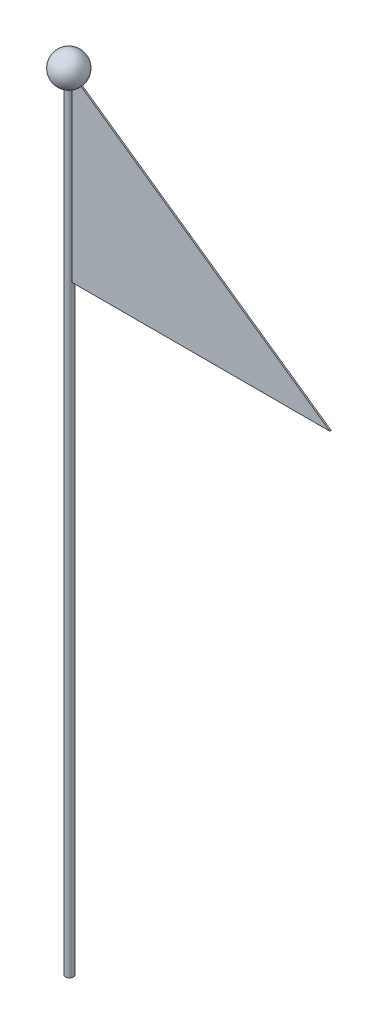
ISO-10303-21;
HEADER;
FILE_DESCRIPTION(('STEP AP214'),'2;1');
FILE_NAME('part.step','',(''),(''),'','','');
FILE_SCHEMA(('AUTOMOTIVE_DESIGN { 1 0 10303 214 1 1 1 1 }'));
ENDSEC;
DATA;
#1=APPLICATION_CONTEXT('core data for automotive mechanical design processes');
#2=APPLICATION_PROTOCOL_DEFINITION('international standard','automotive_design',2000,#1);
#3=PRODUCT_CONTEXT('',#1,'mechanical');
#4=PRODUCT('Part','Part','',(#3));
#5=PRODUCT_RELATED_PRODUCT_CATEGORY('part','',(#4));
#6=PRODUCT_DEFINITION_FORMATION('','',#4);
#7=PRODUCT_DEFINITION_CONTEXT('part definition',#1,'design');
#8=PRODUCT_DEFINITION('design','',#6,#7);
#9=PRODUCT_DEFINITION_SHAPE('','',#8);
#10=(LENGTH_UNIT() NAMED_UNIT(*) SI_UNIT(.MILLI.,.METRE.));
#11=(NAMED_UNIT(*) PLANE_ANGLE_UNIT() SI_UNIT($,.RADIAN.));
#12=(NAMED_UNIT(*) SI_UNIT($,.STERADIAN.) SOLID_ANGLE_UNIT());
#13=UNCERTAINTY_MEASURE_WITH_UNIT(LENGTH_MEASURE(1.E-05),#10,'distance_accuracy_value','');
#14=(GEOMETRIC_REPRESENTATION_CONTEXT(3) GLOBAL_UNCERTAINTY_ASSIGNED_CONTEXT((#13)) GLOBAL_UNIT_ASSIGNED_CONTEXT((#10,
#11,#12)) REPRESENTATION_CONTEXT('',''));
#15=CARTESIAN_POINT('',(0.,0.,0.));
#16=DIRECTION('',(0.,0.,1.));
#17=DIRECTION('',(1.,0.,0.));
#18=AXIS2_PLACEMENT_3D('',#15,#16,#17);
#19=CARTESIAN_POINT('',(0.,-600.,-0.5));
#20=DIRECTION('',(0.,1.,0.));
#21=DIRECTION('',(0.,0.,1.));
#22=AXIS2_PLACEMENT_3D('',#19,#20,#21);
#23=CYLINDRICAL_SURFACE('',#22,3.);
#24=CARTESIAN_POINT('',(-2.09833722086857,-11.5154653786171,-2.64405711386764));
#25=CARTESIAN_POINT('',(-2.21884287735009,-11.5205865961818,-2.52611061655906));
#26=CARTESIAN_POINT('',(-2.32946029768462,-11.526149897107,-2.39790363809497));
#27=CARTESIAN_POINT('',(-2.52766501390432,-11.5379977568933,-2.12464285912076));
#28=CARTESIAN_POINT('',(-2.61522414844018,-11.5442831843699,-1.97956876730836));
#29=CARTESIAN_POINT('',(-2.76468431184615,-11.5573867404033,-1.67685457614372));
#30=CARTESIAN_POINT('',(-2.8265984347987,-11.5642045949895,-1.51922093871473));
#31=CARTESIAN_POINT('',(-2.9230557335242,-11.5781775879587,-1.19585251278525));
#32=CARTESIAN_POINT('',(-2.95760572190757,-11.5853326419219,-1.03011975156893));
#33=CARTESIAN_POINT('',(-2.99840361454821,-11.5997821505947,-0.695106277350074));
#34=CARTESIAN_POINT('',(-3.00463386744059,-11.6070766894003,-0.525823417620668));
#35=CARTESIAN_POINT('',(-2.98856645063279,-11.6215939374037,-0.18860706800513));
#36=CARTESIAN_POINT('',(-2.96626759200543,-11.6288166435952,-0.0206736346487243));
#37=CARTESIAN_POINT('',(-2.89376190141411,-11.6429873672447,0.309104594114983));
#38=CARTESIAN_POINT('',(-2.84354944114666,-11.6499353290025,0.470948154573937));
#39=CARTESIAN_POINT('',(-2.71663113556377,-11.6633595753419,0.783911476173151));
#40=CARTESIAN_POINT('',(-2.63992537524604,-11.6698358614368,0.935031271716288));
#41=CARTESIAN_POINT('',(-2.46222387024155,-11.6821330292276,1.22219426358163));
#42=CARTESIAN_POINT('',(-2.36123718299766,-11.6879541541305,1.35824305421858));
#43=CARTESIAN_POINT('',(-2.13781899465343,-11.6987812711163,1.61145384987166));
#44=CARTESIAN_POINT('',(-2.0153876169152,-11.703787267888,1.72861596352728));
#45=CARTESIAN_POINT('',(-1.75265875906397,-11.7128411233779,1.94062664383531));
#46=CARTESIAN_POINT('',(-1.61237560116498,-11.7168897428239,2.03549292628482));
#47=CARTESIAN_POINT('',(-1.31784799441581,-11.7239215903017,2.20032503081649));
#48=CARTESIAN_POINT('',(-1.16360359948885,-11.7269048224483,2.27029094906749));
#49=CARTESIAN_POINT('',(-0.845676816640813,-11.7317210776196,2.38327361063245));
#50=CARTESIAN_POINT('',(-0.682002776610422,-11.7335551014381,2.42631380229375));
#51=CARTESIAN_POINT('',(-0.349744050129343,-11.7360263143853,2.48431209396417));
#52=CARTESIAN_POINT('',(-0.181159384385559,-11.73666350856,2.49927031237068));
#53=CARTESIAN_POINT('',(0.156032304885742,-11.7367234386341,2.50067707397895));
#54=CARTESIAN_POINT('',(0.324639260591168,-11.7361468682911,2.48714190329571));
#55=CARTESIAN_POINT('',(0.65718501750307,-11.7337966066423,2.43198143440767));
#56=CARTESIAN_POINT('',(0.821123823112077,-11.7320229164655,2.39035616269554));
#57=CARTESIAN_POINT('',(1.13967683886114,-11.7273274959477,2.28020472349768));
#58=CARTESIAN_POINT('',(1.29429132018055,-11.7244057990128,2.21167933878371));
#59=CARTESIAN_POINT('',(1.58981914433573,-11.7174951396611,2.04968045013669));
#60=CARTESIAN_POINT('',(1.73073245897503,-11.7135061750479,1.95620689486274));
#61=CARTESIAN_POINT('',(1.99493978652167,-11.7045690250923,1.746916144877));
#62=CARTESIAN_POINT('',(2.11822450553634,-11.6996203369941,1.63108723935805));
#63=CARTESIAN_POINT('',(2.34360075563056,-11.6889024001229,1.38041065280345));
#64=CARTESIAN_POINT('',(2.44569219259298,-11.6831331477061,1.24556288731151));
#65=CARTESIAN_POINT('',(2.62587747326923,-11.6709292915723,0.960553321580823));
#66=CARTESIAN_POINT('',(2.70395067531341,-11.6644941218662,0.810378495784326));
#67=CARTESIAN_POINT('',(2.83377744813021,-11.6511423368069,0.499073220711405));
#68=CARTESIAN_POINT('',(2.88553089528514,-11.6442257191927,0.337942719982778));
#69=CARTESIAN_POINT('',(2.96129046646025,-11.6300992155395,0.00915786377289607));
#70=CARTESIAN_POINT('',(2.9852737390918,-11.6228890930251,-0.158501747269686));
#71=CARTESIAN_POINT('',(3.00473964422691,-11.6083844071586,-0.495464052593353));
#72=CARTESIAN_POINT('',(3.00022217478962,-11.6010898435046,-0.664766752749241));
#73=CARTESIAN_POINT('',(2.96280599290766,-11.5866201474837,-1.00028593417167));
#74=CARTESIAN_POINT('',(2.9298950786367,-11.5794450678153,-1.16650105720499));
#75=CARTESIAN_POINT('',(2.83660509741384,-11.5654225662293,-1.49105006406071));
#76=CARTESIAN_POINT('',(2.77622605737745,-11.5585751439905,-1.64938395560561));
#77=CARTESIAN_POINT('',(2.62971826772468,-11.5454058918125,-1.95364619301627));
#78=CARTESIAN_POINT('',(2.54359361693635,-11.5390839784142,-2.09957650884622));
#79=CARTESIAN_POINT('',(2.34802806285612,-11.5271474549699,-2.3749072429916));
#80=CARTESIAN_POINT('',(2.23858719026123,-11.5215328439925,-2.50430768306911));
#81=CARTESIAN_POINT('',(1.99957430575861,-11.5111780187829,-2.7428074727851));
#82=CARTESIAN_POINT('',(1.87001622192704,-11.5064372045103,-2.8519207541678));
#83=CARTESIAN_POINT('',(1.59438855943176,-11.4979638925616,-3.04684434643672));
#84=CARTESIAN_POINT('',(1.44831902981453,-11.4942313918904,-3.13265472654057));
#85=CARTESIAN_POINT('',(1.14395616062785,-11.4878873177269,-3.27845508194393));
#86=CARTESIAN_POINT('',(0.985673925026176,-11.4852747398312,-3.33846819367078));
#87=CARTESIAN_POINT('',(0.661272863941099,-11.4812427255452,-3.43106959322617));
#88=CARTESIAN_POINT('',(0.495154383213852,-11.4798232367166,-3.46365908637257));
#89=CARTESIAN_POINT('',(0.159940793209374,-11.4782197849481,-3.50047122131539));
#90=CARTESIAN_POINT('',(-0.00915168953449652,-11.4780347817778,-3.50471774611004));
#91=CARTESIAN_POINT('',(-0.345694970286541,-11.4789032634719,-3.48478004981468));
#92=CARTESIAN_POINT('',(-0.513145352874546,-11.4799570539726,-3.46058881253398));
#93=CARTESIAN_POINT('',(-0.841630082695032,-11.4832723453062,-3.38445896550704));
#94=CARTESIAN_POINT('',(-1.0026627980562,-11.4855341512317,-3.33251334620052));
#95=CARTESIAN_POINT('',(-1.31357245619867,-11.4911978074179,-3.20238090405853));
#96=CARTESIAN_POINT('',(-1.46346258602474,-11.4945982829639,-3.12422572382849));
#97=CARTESIAN_POINT('',(-1.69431466894698,-11.5009579603361,-2.97797191905887));
#98=CARTESIAN_POINT('',(-1.77998880653241,-11.5036016621179,-2.91715679913551));
#99=CARTESIAN_POINT('',(-1.94449793063287,-11.5092616147411,-2.78690512059727));
#100=CARTESIAN_POINT('',(-2.0233329177356,-11.5122778655505,-2.71746856272325));
#101=CARTESIAN_POINT('',(-2.09833722086857,-11.5154653786171,-2.64405711386764));
#102=B_SPLINE_CURVE_WITH_KNOTS('',3,(#24,#25,#26,#27,#28,#29,#30,#31,#32,#33,#34,#35,#36,#37,
#38,#39,#40,#41,#42,#43,#44,#45,#46,#47,#48,#49,#50,#51,#52,#53,#54,#55,#56,#57,#58,#59,#60,#61,
#62,#63,#64,#65,#66,#67,#68,#69,#70,#71,#72,#73,#74,#75,#76,#77,#78,#79,#80,#81,#82,#83,#84,#85,
#86,#87,#88,#89,#90,#91,#92,#93,#94,#95,#96,#97,#98,#99,#100,#101),.UNSPECIFIED.,.T.,.F.,(4,2,2,
2,2,2,2,2,2,2,2,2,2,2,2,2,2,2,2,2,2,2,2,2,2,2,2,2,2,2,2,2,2,2,2,2,2,2,4),(0.,0.505712124684648,
1.01203904669454,1.51810712368354,2.02404916966916,2.53030652030145,3.03658496947845,
3.54296553814819,4.04934448222652,4.555534825516,5.06172225700528,5.56750611247222,
6.07328801450711,6.57862883950979,7.08396753392243,7.58901746768815,8.09406692512574,
8.59910168711768,9.10413748842977,9.60943857338958,10.1147419022906,10.6204782918496,
11.1262170567118,11.6323716863867,12.1385281264658,12.6449021911092,13.151275759567,
13.6575687537543,14.1638610813846,14.6698044296341,15.1757462750414,15.6812334120754,
16.1866983308709,16.6917372694591,17.1969008378725,17.7021920491722,18.2068754092992,
18.5216373040089,18.8363991716702),.UNSPECIFIED.);
#103=CARTESIAN_POINT('',(3.,-11.6081867662439,-0.5));
#104=VERTEX_POINT('',#103);
#105=CARTESIAN_POINT('',(2.82842712474619,-11.651180197731,0.5));
#106=VERTEX_POINT('',#105);
#107=EDGE_CURVE('E70',#104,#106,#102,.T.);
#108=ORIENTED_EDGE('',*,*,#107,.F.);
#109=DIRECTION('',(0.,1.,0.));
#110=VECTOR('',#109,1.);
#111=CARTESIAN_POINT('',(3.,-600.,-0.5));
#112=LINE('',#111,#110);
#113=CARTESIAN_POINT('',(3.,-140.,-0.5));
#114=VERTEX_POINT('',#113);
#115=EDGE_CURVE('E98',#114,#104,#112,.T.);
#116=ORIENTED_EDGE('',*,*,#115,.F.);
#117=CARTESIAN_POINT('',(0.,-140.,-0.5));
#118=DIRECTION('',(0.,-1.,0.));
#119=DIRECTION('',(0.,0.,-1.));
#120=AXIS2_PLACEMENT_3D('',#117,#118,#119);
#121=CIRCLE('',#120,3.);
#122=CARTESIAN_POINT('',(2.82842712474619,-140.,0.5));
#123=VERTEX_POINT('',#122);
#124=EDGE_CURVE('E131',#114,#123,#121,.T.);
#125=ORIENTED_EDGE('',*,*,#124,.T.);
#126=DIRECTION('',(0.,1.,0.));
#127=VECTOR('',#126,1.);
#128=CARTESIAN_POINT('',(2.82842712474619,-600.,0.5));
#129=LINE('',#128,#127);
#130=EDGE_CURVE('E55',#123,#106,#129,.T.);
#131=ORIENTED_EDGE('',*,*,#130,.T.);
#132=EDGE_LOOP('',(#108,#116,#125,#131));
#133=FACE_BOUND('',#132,.T.);
#134=CARTESIAN_POINT('',(0.,-600.,-0.5));
#135=DIRECTION('',(0.,1.,0.));
#136=DIRECTION('',(0.,0.,1.));
#137=AXIS2_PLACEMENT_3D('',#134,#135,#136);
#138=CIRCLE('',#137,3.);
#139=CARTESIAN_POINT('',(0.,-600.,2.5));
#140=VERTEX_POINT('',#139);
#141=EDGE_CURVE('E107',#140,#140,#138,.T.);
#142=ORIENTED_EDGE('',*,*,#141,.T.);
#143=EDGE_LOOP('',(#142));
#144=FACE_BOUND('',#143,.T.);
#145=ADVANCED_FACE('F47',(#133,#144),#23,.T.);
#146=CARTESIAN_POINT('',(0.,-600.,-0.5));
#147=DIRECTION('',(0.,1.,0.));
#148=DIRECTION('',(0.,0.,1.));
#149=AXIS2_PLACEMENT_3D('',#146,#147,#148);
#150=PLANE('',#149);
#151=ORIENTED_EDGE('',*,*,#141,.F.);
#152=EDGE_LOOP('',(#151));
#153=FACE_BOUND('',#152,.T.);
#154=ADVANCED_FACE('F120',(#153),#150,.F.);
#155=CARTESIAN_POINT('',(200.,-140.,-0.5));
#156=DIRECTION('',(0.573462344363328,0.819231920519041,0.));
#157=DIRECTION('',(-0.81923192051904,0.573462344363328,0.));
#158=AXIS2_PLACEMENT_3D('',#155,#156,#157);
#159=PLANE('',#158);
#160=CARTESIAN_POINT('',(0.,0.,0.));
#161=DIRECTION('',(0.573462344363328,0.819231920519041,0.));
#162=DIRECTION('',(-0.81923192051904,0.573462344363328,0.));
#163=AXIS2_PLACEMENT_3D('',#160,#161,#162);
#164=CIRCLE('',#163,12.);
#165=CARTESIAN_POINT('',(9.82224567332308,-6.87557197132617,0.5));
#166=VERTEX_POINT('',#165);
#167=CARTESIAN_POINT('',(9.82224567332308,-6.87557197132617,-0.5));
#168=VERTEX_POINT('',#167);
#169=EDGE_CURVE('E101',#166,#168,#164,.T.);
#170=ORIENTED_EDGE('',*,*,#169,.F.);
#171=DIRECTION('',(-0.819231920519041,0.573462344363328,0.));
#172=VECTOR('',#171,1.);
#173=CARTESIAN_POINT('',(200.,-140.,0.5));
#174=LINE('',#173,#172);
#175=CARTESIAN_POINT('',(200.,-140.,0.5));
#176=VERTEX_POINT('',#175);
#177=EDGE_CURVE('E90',#176,#166,#174,.T.);
#178=ORIENTED_EDGE('',*,*,#177,.F.);
#179=DIRECTION('',(0.,0.,1.));
#180=VECTOR('',#179,1.);
#181=CARTESIAN_POINT('',(200.,-140.,-0.5));
#182=LINE('',#181,#180);
#183=CARTESIAN_POINT('',(200.,-140.,-0.5));
#184=VERTEX_POINT('',#183);
#185=EDGE_CURVE('E140',#184,#176,#182,.T.);
#186=ORIENTED_EDGE('',*,*,#185,.F.);
#187=DIRECTION('',(-0.819231920519041,0.573462344363328,0.));
#188=VECTOR('',#187,1.);
#189=CARTESIAN_POINT('',(200.,-140.,-0.5));
#190=LINE('',#189,#188);
#191=EDGE_CURVE('E102',#184,#168,#190,.T.);
#192=ORIENTED_EDGE('',*,*,#191,.T.);
#193=EDGE_LOOP('',(#170,#178,#186,#192));
#194=FACE_BOUND('',#193,.T.);
#195=ADVANCED_FACE('F49',(#194),#159,.T.);
#196=CARTESIAN_POINT('',(0.,-140.,-0.5));
#197=DIRECTION('',(0.,-1.,0.));
#198=DIRECTION('',(0.,0.,-1.));
#199=AXIS2_PLACEMENT_3D('',#196,#197,#198);
#200=PLANE('',#199);
#201=ORIENTED_EDGE('',*,*,#124,.F.);
#202=DIRECTION('',(1.,0.,0.));
#203=VECTOR('',#202,1.);
#204=CARTESIAN_POINT('',(0.,-140.,-0.5));
#205=LINE('',#204,#203);
#206=EDGE_CURVE('E138',#114,#184,#205,.T.);
#207=ORIENTED_EDGE('',*,*,#206,.T.);
#208=ORIENTED_EDGE('',*,*,#185,.T.);
#209=DIRECTION('',(1.,0.,0.));
#210=VECTOR('',#209,1.);
#211=CARTESIAN_POINT('',(0.,-140.,0.5));
#212=LINE('',#211,#210);
#213=EDGE_CURVE('E94',#123,#176,#212,.T.);
#214=ORIENTED_EDGE('',*,*,#213,.F.);
#215=EDGE_LOOP('',(#201,#207,#208,#214));
#216=FACE_BOUND('',#215,.T.);
#217=ADVANCED_FACE('F127',(#216),#200,.T.);
#218=CARTESIAN_POINT('',(0.,0.,-0.5));
#219=DIRECTION('',(0.,0.,1.));
#220=DIRECTION('',(1.,0.,0.));
#221=AXIS2_PLACEMENT_3D('',#218,#219,#220);
#222=PLANE('',#221);
#223=ORIENTED_EDGE('',*,*,#115,.T.);
#224=CARTESIAN_POINT('',(0.,0.,-0.5));
#225=DIRECTION('',(0.,0.,1.));
#226=DIRECTION('',(1.,0.,0.));
#227=AXIS2_PLACEMENT_3D('',#224,#225,#226);
#228=CIRCLE('',#227,11.9895788082818);
#229=EDGE_CURVE('E62',#104,#168,#228,.T.);
#230=ORIENTED_EDGE('',*,*,#229,.T.);
#231=ORIENTED_EDGE('',*,*,#191,.F.);
#232=ORIENTED_EDGE('',*,*,#206,.F.);
#233=EDGE_LOOP('',(#223,#230,#231,#232));
#234=FACE_BOUND('',#233,.T.);
#235=ADVANCED_FACE('F143',(#234),#222,.F.);
#236=CARTESIAN_POINT('',(0.,0.,0.5));
#237=DIRECTION('',(0.,0.,1.));
#238=DIRECTION('',(1.,0.,0.));
#239=AXIS2_PLACEMENT_3D('',#236,#237,#238);
#240=PLANE('',#239);
#241=CARTESIAN_POINT('',(0.,0.,0.5));
#242=DIRECTION('',(0.,0.,1.));
#243=DIRECTION('',(1.,0.,0.));
#244=AXIS2_PLACEMENT_3D('',#241,#242,#243);
#245=CIRCLE('',#244,11.9895788082818);
#246=EDGE_CURVE('E11',#106,#166,#245,.T.);
#247=ORIENTED_EDGE('',*,*,#246,.F.);
#248=ORIENTED_EDGE('',*,*,#130,.F.);
#249=ORIENTED_EDGE('',*,*,#213,.T.);
#250=ORIENTED_EDGE('',*,*,#177,.T.);
#251=EDGE_LOOP('',(#247,#248,#249,#250));
#252=FACE_BOUND('',#251,.T.);
#253=ADVANCED_FACE('F92',(#252),#240,.T.);
#254=CARTESIAN_POINT('',(0.,0.,0.));
#255=DIRECTION('',(0.,1.,0.));
#256=DIRECTION('',(1.,0.,0.));
#257=AXIS2_PLACEMENT_3D('',#254,#255,#256);
#258=SPHERICAL_SURFACE('',#257,12.);
#259=ORIENTED_EDGE('',*,*,#229,.F.);
#260=ORIENTED_EDGE('',*,*,#107,.T.);
#261=ORIENTED_EDGE('',*,*,#246,.T.);
#262=ORIENTED_EDGE('',*,*,#169,.T.);
#263=EDGE_LOOP('',(#259,#260,#261,#262));
#264=FACE_BOUND('',#263,.T.);
#265=ADVANCED_FACE('F105',(#264),#258,.T.);
#266=CLOSED_SHELL('',(#145,#154,#195,#217,#235,#253,#265));
#267=MANIFOLD_SOLID_BREP('B2',#266);
#268=ADVANCED_BREP_SHAPE_REPRESENTATION('',(#18,#267),#14);
#269=SHAPE_DEFINITION_REPRESENTATION(#9,#268);
ENDSEC;
END-ISO-10303-21;
